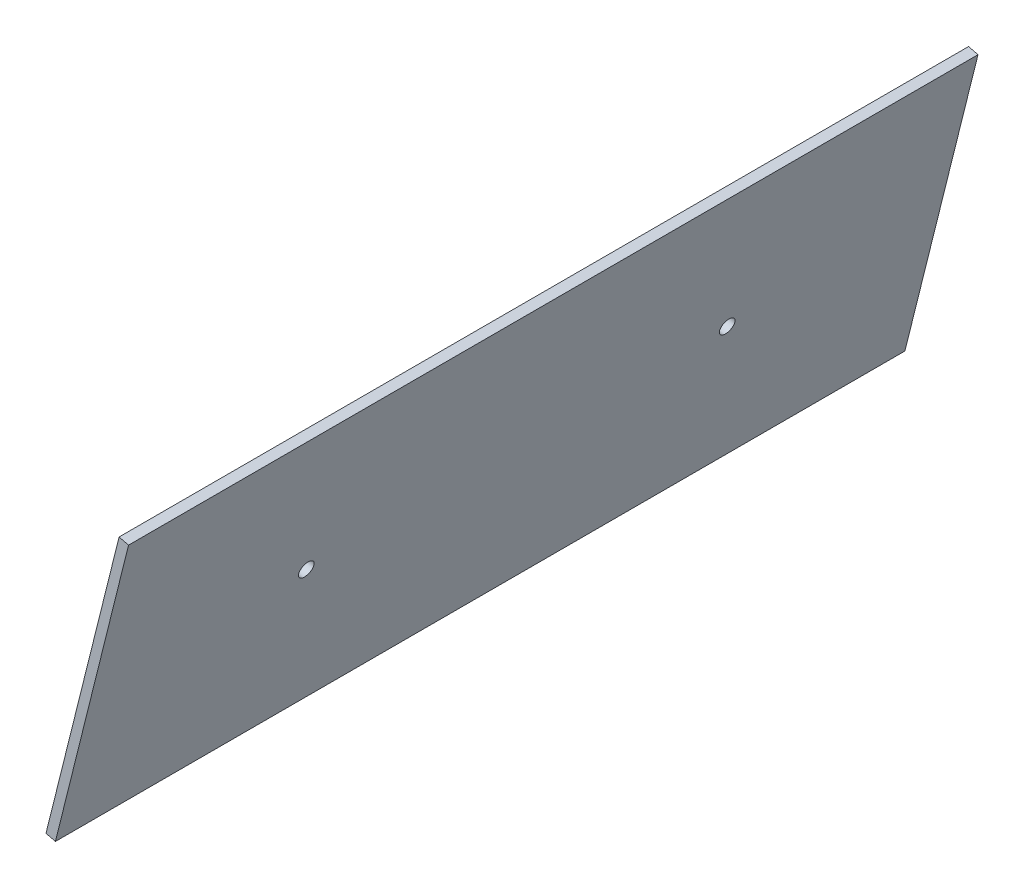
ISO-10303-21;
HEADER;
FILE_DESCRIPTION(('STEP AP214'),'2;1');
FILE_NAME('part.step','',(''),(''),'','','');
FILE_SCHEMA(('AUTOMOTIVE_DESIGN { 1 0 10303 214 1 1 1 1 }'));
ENDSEC;
DATA;
#1=APPLICATION_CONTEXT('core data for automotive mechanical design processes');
#2=APPLICATION_PROTOCOL_DEFINITION('international standard','automotive_design',2000,#1);
#3=PRODUCT_CONTEXT('',#1,'mechanical');
#4=PRODUCT('Part','Part','',(#3));
#5=PRODUCT_RELATED_PRODUCT_CATEGORY('part','',(#4));
#6=PRODUCT_DEFINITION_FORMATION('','',#4);
#7=PRODUCT_DEFINITION_CONTEXT('part definition',#1,'design');
#8=PRODUCT_DEFINITION('design','',#6,#7);
#9=PRODUCT_DEFINITION_SHAPE('','',#8);
#10=(LENGTH_UNIT() NAMED_UNIT(*) SI_UNIT(.MILLI.,.METRE.));
#11=(NAMED_UNIT(*) PLANE_ANGLE_UNIT() SI_UNIT($,.RADIAN.));
#12=(NAMED_UNIT(*) SI_UNIT($,.STERADIAN.) SOLID_ANGLE_UNIT());
#13=UNCERTAINTY_MEASURE_WITH_UNIT(LENGTH_MEASURE(1.E-05),#10,'distance_accuracy_value','');
#14=(GEOMETRIC_REPRESENTATION_CONTEXT(3) GLOBAL_UNCERTAINTY_ASSIGNED_CONTEXT((#13)) GLOBAL_UNIT_ASSIGNED_CONTEXT((#10,
#11,#12)) REPRESENTATION_CONTEXT('',''));
#15=CARTESIAN_POINT('',(0.,0.,0.));
#16=DIRECTION('',(0.,0.,1.));
#17=DIRECTION('',(1.,0.,0.));
#18=AXIS2_PLACEMENT_3D('',#15,#16,#17);
#19=CARTESIAN_POINT('',(-37.6295089192946,-38.8248778445668,277.475));
#20=DIRECTION('',(-0.241921895599664,-0.970295726275997,0.));
#21=DIRECTION('',(0.970295726275998,-0.241921895599664,0.));
#22=AXIS2_PLACEMENT_3D('',#19,#20,#21);
#23=PLANE('',#22);
#24=DIRECTION('',(-0.970295726275997,0.241921895599664,0.));
#25=VECTOR('',#24,1.);
#26=CARTESIAN_POINT('',(-37.6295089192946,-38.8248778445668,0.));
#27=LINE('',#26,#25);
#28=CARTESIAN_POINT('',(-37.6295089192946,-38.8248778445668,0.));
#29=VERTEX_POINT('',#28);
#30=CARTESIAN_POINT('',(-40.7101978502209,-38.0567758260379,0.));
#31=VERTEX_POINT('',#30);
#32=EDGE_CURVE('E121',#29,#31,#27,.T.);
#33=ORIENTED_EDGE('',*,*,#32,.F.);
#34=DIRECTION('',(0.,0.,-1.));
#35=VECTOR('',#34,1.);
#36=CARTESIAN_POINT('',(-37.6295089192946,-38.8248778445668,277.475));
#37=LINE('',#36,#35);
#38=CARTESIAN_POINT('',(-37.6295089192946,-38.8248778445668,277.475));
#39=VERTEX_POINT('',#38);
#40=EDGE_CURVE('E11',#39,#29,#37,.T.);
#41=ORIENTED_EDGE('',*,*,#40,.F.);
#42=DIRECTION('',(-0.970295726275997,0.241921895599664,0.));
#43=VECTOR('',#42,1.);
#44=CARTESIAN_POINT('',(-37.6295089192946,-38.8248778445668,277.475));
#45=LINE('',#44,#43);
#46=CARTESIAN_POINT('',(-40.7101978502209,-38.0567758260379,277.475));
#47=VERTEX_POINT('',#46);
#48=EDGE_CURVE('E112',#39,#47,#45,.T.);
#49=ORIENTED_EDGE('',*,*,#48,.T.);
#50=DIRECTION('',(0.,0.,-1.));
#51=VECTOR('',#50,1.);
#52=CARTESIAN_POINT('',(-40.7101978502209,-38.0567758260379,277.475));
#53=LINE('',#52,#51);
#54=EDGE_CURVE('E52',#47,#31,#53,.T.);
#55=ORIENTED_EDGE('',*,*,#54,.T.);
#56=EDGE_LOOP('',(#33,#41,#49,#55));
#57=FACE_BOUND('',#56,.T.);
#58=ADVANCED_FACE('F49',(#57),#23,.T.);
#59=CARTESIAN_POINT('',(-37.6295089192946,-38.8248778445668,277.475));
#60=DIRECTION('',(-0.970295726275997,0.241921895599665,0.));
#61=DIRECTION('',(-0.241921895599665,-0.970295726275997,0.));
#62=AXIS2_PLACEMENT_3D('',#59,#60,#61);
#63=PLANE('',#62);
#64=CARTESIAN_POINT('',(-25.6805388904673,9.09982332244597,207.475));
#65=DIRECTION('',(0.970295726275997,-0.241921895599665,0.));
#66=DIRECTION('',(0.241921895599665,0.970295726275997,0.));
#67=AXIS2_PLACEMENT_3D('',#64,#65,#66);
#68=CIRCLE('',#67,2.5);
#69=CARTESIAN_POINT('',(-25.0757341514681,11.525562638136,207.475));
#70=VERTEX_POINT('',#69);
#71=EDGE_CURVE('E126',#70,#70,#68,.T.);
#72=ORIENTED_EDGE('',*,*,#71,.F.);
#73=EDGE_LOOP('',(#72));
#74=FACE_BOUND('',#73,.T.);
#75=CARTESIAN_POINT('',(-25.6805388904673,9.09982332244597,70.));
#76=DIRECTION('',(0.970295726275997,-0.241921895599665,0.));
#77=DIRECTION('',(0.241921895599665,0.970295726275997,0.));
#78=AXIS2_PLACEMENT_3D('',#75,#76,#77);
#79=CIRCLE('',#78,2.5);
#80=CARTESIAN_POINT('',(-25.0757341514681,11.525562638136,70.));
#81=VERTEX_POINT('',#80);
#82=EDGE_CURVE('E166',#81,#81,#79,.T.);
#83=ORIENTED_EDGE('',*,*,#82,.F.);
#84=EDGE_LOOP('',(#83));
#85=FACE_BOUND('',#84,.T.);
#86=DIRECTION('',(0.241921895599665,0.970295726275997,0.));
#87=VECTOR('',#86,1.);
#88=CARTESIAN_POINT('',(-37.6295089192946,-38.8248778445668,0.));
#89=LINE('',#88,#87);
#90=CARTESIAN_POINT('',(-13.7518178236077,56.9433103388741,0.));
#91=VERTEX_POINT('',#90);
#92=EDGE_CURVE('E115',#29,#91,#89,.T.);
#93=ORIENTED_EDGE('',*,*,#92,.T.);
#94=DIRECTION('',(0.,0.,-1.));
#95=VECTOR('',#94,1.);
#96=CARTESIAN_POINT('',(-13.7518178236077,56.9433103388741,277.475));
#97=LINE('',#96,#95);
#98=CARTESIAN_POINT('',(-13.7518178236077,56.9433103388741,277.475));
#99=VERTEX_POINT('',#98);
#100=EDGE_CURVE('E59',#99,#91,#97,.T.);
#101=ORIENTED_EDGE('',*,*,#100,.F.);
#102=DIRECTION('',(0.241921895599665,0.970295726275997,0.));
#103=VECTOR('',#102,1.);
#104=CARTESIAN_POINT('',(-37.6295089192946,-38.8248778445668,277.475));
#105=LINE('',#104,#103);
#106=EDGE_CURVE('E107',#39,#99,#105,.T.);
#107=ORIENTED_EDGE('',*,*,#106,.F.);
#108=ORIENTED_EDGE('',*,*,#40,.T.);
#109=EDGE_LOOP('',(#93,#101,#107,#108));
#110=FACE_BOUND('',#109,.T.);
#111=ADVANCED_FACE('F137',(#74,#85,#110),#63,.F.);
#112=CARTESIAN_POINT('',(-16.832506754534,57.7114123574031,277.475));
#113=DIRECTION('',(0.241921895599664,0.970295726275997,0.));
#114=DIRECTION('',(-0.970295726275997,0.241921895599664,0.));
#115=AXIS2_PLACEMENT_3D('',#112,#113,#114);
#116=PLANE('',#115);
#117=DIRECTION('',(0.970295726275997,-0.241921895599664,0.));
#118=VECTOR('',#117,1.);
#119=CARTESIAN_POINT('',(-16.832506754534,57.7114123574031,0.));
#120=LINE('',#119,#118);
#121=CARTESIAN_POINT('',(-16.832506754534,57.7114123574031,0.));
#122=VERTEX_POINT('',#121);
#123=EDGE_CURVE('E100',#122,#91,#120,.T.);
#124=ORIENTED_EDGE('',*,*,#123,.F.);
#125=DIRECTION('',(0.,0.,-1.));
#126=VECTOR('',#125,1.);
#127=CARTESIAN_POINT('',(-16.832506754534,57.7114123574031,277.475));
#128=LINE('',#127,#126);
#129=CARTESIAN_POINT('',(-16.832506754534,57.7114123574031,277.475));
#130=VERTEX_POINT('',#129);
#131=EDGE_CURVE('E95',#130,#122,#128,.T.);
#132=ORIENTED_EDGE('',*,*,#131,.F.);
#133=DIRECTION('',(0.970295726275997,-0.241921895599664,0.));
#134=VECTOR('',#133,1.);
#135=CARTESIAN_POINT('',(-16.832506754534,57.7114123574031,277.475));
#136=LINE('',#135,#134);
#137=EDGE_CURVE('E98',#130,#99,#136,.T.);
#138=ORIENTED_EDGE('',*,*,#137,.T.);
#139=ORIENTED_EDGE('',*,*,#100,.T.);
#140=EDGE_LOOP('',(#124,#132,#138,#139));
#141=FACE_BOUND('',#140,.T.);
#142=ADVANCED_FACE('F97',(#141),#116,.T.);
#143=CARTESIAN_POINT('',(-40.7101978502209,-38.0567758260379,277.475));
#144=DIRECTION('',(-0.970295726275997,0.241921895599665,0.));
#145=DIRECTION('',(-0.241921895599665,-0.970295726275997,0.));
#146=AXIS2_PLACEMENT_3D('',#143,#144,#145);
#147=PLANE('',#146);
#148=CARTESIAN_POINT('',(-28.7612278213935,9.8679253409749,207.475));
#149=DIRECTION('',(-0.970295726275997,0.241921895599665,0.));
#150=DIRECTION('',(-0.241921895599665,-0.970295726275997,0.));
#151=AXIS2_PLACEMENT_3D('',#148,#149,#150);
#152=CIRCLE('',#151,2.5);
#153=CARTESIAN_POINT('',(-29.3660325603927,7.44218602528491,207.475));
#154=VERTEX_POINT('',#153);
#155=EDGE_CURVE('E160',#154,#154,#152,.F.);
#156=ORIENTED_EDGE('',*,*,#155,.T.);
#157=EDGE_LOOP('',(#156));
#158=FACE_BOUND('',#157,.T.);
#159=CARTESIAN_POINT('',(-28.7612278213935,9.8679253409749,70.));
#160=DIRECTION('',(-0.970295726275997,0.241921895599665,0.));
#161=DIRECTION('',(-0.241921895599665,-0.970295726275997,0.));
#162=AXIS2_PLACEMENT_3D('',#159,#160,#161);
#163=CIRCLE('',#162,2.5);
#164=CARTESIAN_POINT('',(-29.3660325603927,7.44218602528491,70.));
#165=VERTEX_POINT('',#164);
#166=EDGE_CURVE('E163',#165,#165,#163,.F.);
#167=ORIENTED_EDGE('',*,*,#166,.T.);
#168=EDGE_LOOP('',(#167));
#169=FACE_BOUND('',#168,.T.);
#170=DIRECTION('',(0.241921895599665,0.970295726275997,0.));
#171=VECTOR('',#170,1.);
#172=CARTESIAN_POINT('',(-40.7101978502209,-38.0567758260379,0.));
#173=LINE('',#172,#171);
#174=EDGE_CURVE('E125',#31,#122,#173,.T.);
#175=ORIENTED_EDGE('',*,*,#174,.F.);
#176=ORIENTED_EDGE('',*,*,#54,.F.);
#177=DIRECTION('',(0.241921895599665,0.970295726275997,0.));
#178=VECTOR('',#177,1.);
#179=CARTESIAN_POINT('',(-40.7101978502209,-38.0567758260379,277.475));
#180=LINE('',#179,#178);
#181=EDGE_CURVE('E106',#47,#130,#180,.T.);
#182=ORIENTED_EDGE('',*,*,#181,.T.);
#183=ORIENTED_EDGE('',*,*,#131,.T.);
#184=EDGE_LOOP('',(#175,#176,#182,#183));
#185=FACE_BOUND('',#184,.T.);
#186=ADVANCED_FACE('F110',(#158,#169,#185),#147,.T.);
#187=CARTESIAN_POINT('',(0.,0.,277.475));
#188=DIRECTION('',(0.,0.,-1.));
#189=DIRECTION('',(-1.,0.,0.));
#190=AXIS2_PLACEMENT_3D('',#187,#188,#189);
#191=PLANE('',#190);
#192=ORIENTED_EDGE('',*,*,#48,.F.);
#193=ORIENTED_EDGE('',*,*,#106,.T.);
#194=ORIENTED_EDGE('',*,*,#137,.F.);
#195=ORIENTED_EDGE('',*,*,#181,.F.);
#196=EDGE_LOOP('',(#192,#193,#194,#195));
#197=FACE_BOUND('',#196,.T.);
#198=ADVANCED_FACE('F105',(#197),#191,.F.);
#199=CARTESIAN_POINT('',(0.,0.,0.));
#200=DIRECTION('',(0.,0.,-1.));
#201=DIRECTION('',(-1.,0.,0.));
#202=AXIS2_PLACEMENT_3D('',#199,#200,#201);
#203=PLANE('',#202);
#204=ORIENTED_EDGE('',*,*,#32,.T.);
#205=ORIENTED_EDGE('',*,*,#174,.T.);
#206=ORIENTED_EDGE('',*,*,#123,.T.);
#207=ORIENTED_EDGE('',*,*,#92,.F.);
#208=EDGE_LOOP('',(#204,#205,#206,#207));
#209=FACE_BOUND('',#208,.T.);
#210=ADVANCED_FACE('F136',(#209),#203,.T.);
#211=CARTESIAN_POINT('',(-51.2426245167977,15.4731670801652,70.));
#212=DIRECTION('',(0.970295726275997,-0.241921895599665,0.));
#213=DIRECTION('',(0.241921895599665,0.970295726275997,0.));
#214=AXIS2_PLACEMENT_3D('',#211,#212,#213);
#215=CYLINDRICAL_SURFACE('',#214,2.5);
#216=ORIENTED_EDGE('',*,*,#166,.F.);
#217=EDGE_LOOP('',(#216));
#218=FACE_BOUND('',#217,.T.);
#219=ORIENTED_EDGE('',*,*,#82,.T.);
#220=EDGE_LOOP('',(#219));
#221=FACE_BOUND('',#220,.T.);
#222=ADVANCED_FACE('F178',(#218,#221),#215,.F.);
#223=CARTESIAN_POINT('',(-51.2426245167977,15.4731670801652,207.475));
#224=DIRECTION('',(0.970295726275997,-0.241921895599665,0.));
#225=DIRECTION('',(0.241921895599665,0.970295726275997,0.));
#226=AXIS2_PLACEMENT_3D('',#223,#224,#225);
#227=CYLINDRICAL_SURFACE('',#226,2.5);
#228=ORIENTED_EDGE('',*,*,#155,.F.);
#229=EDGE_LOOP('',(#228));
#230=FACE_BOUND('',#229,.T.);
#231=ORIENTED_EDGE('',*,*,#71,.T.);
#232=EDGE_LOOP('',(#231));
#233=FACE_BOUND('',#232,.T.);
#234=ADVANCED_FACE('F176',(#230,#233),#227,.F.);
#235=CLOSED_SHELL('',(#58,#111,#142,#186,#198,#210,#222,#234));
#236=MANIFOLD_SOLID_BREP('B2',#235);
#237=ADVANCED_BREP_SHAPE_REPRESENTATION('',(#18,#236),#14);
#238=SHAPE_DEFINITION_REPRESENTATION(#9,#237);
ENDSEC;
END-ISO-10303-21;
